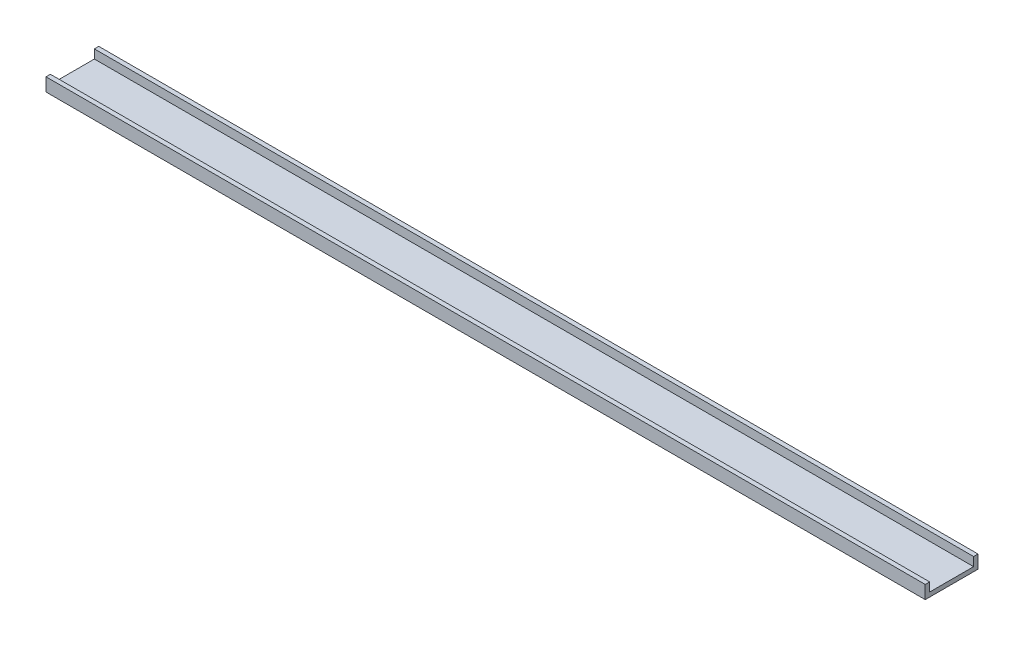
ISO-10303-21;
HEADER;
FILE_DESCRIPTION(('STEP AP214'),'2;1');
FILE_NAME('part.step','',(''),(''),'','','');
FILE_SCHEMA(('AUTOMOTIVE_DESIGN { 1 0 10303 214 1 1 1 1 }'));
ENDSEC;
DATA;
#1=APPLICATION_CONTEXT('core data for automotive mechanical design processes');
#2=APPLICATION_PROTOCOL_DEFINITION('international standard','automotive_design',2000,#1);
#3=PRODUCT_CONTEXT('',#1,'mechanical');
#4=PRODUCT('Part','Part','',(#3));
#5=PRODUCT_RELATED_PRODUCT_CATEGORY('part','',(#4));
#6=PRODUCT_DEFINITION_FORMATION('','',#4);
#7=PRODUCT_DEFINITION_CONTEXT('part definition',#1,'design');
#8=PRODUCT_DEFINITION('design','',#6,#7);
#9=PRODUCT_DEFINITION_SHAPE('','',#8);
#10=(LENGTH_UNIT() NAMED_UNIT(*) SI_UNIT(.MILLI.,.METRE.));
#11=(NAMED_UNIT(*) PLANE_ANGLE_UNIT() SI_UNIT($,.RADIAN.));
#12=(NAMED_UNIT(*) SI_UNIT($,.STERADIAN.) SOLID_ANGLE_UNIT());
#13=UNCERTAINTY_MEASURE_WITH_UNIT(LENGTH_MEASURE(1.E-05),#10,'distance_accuracy_value','');
#14=(GEOMETRIC_REPRESENTATION_CONTEXT(3) GLOBAL_UNCERTAINTY_ASSIGNED_CONTEXT((#13)) GLOBAL_UNIT_ASSIGNED_CONTEXT((#10,
#11,#12)) REPRESENTATION_CONTEXT('',''));
#15=CARTESIAN_POINT('',(0.,0.,0.));
#16=DIRECTION('',(0.,0.,1.));
#17=DIRECTION('',(1.,0.,0.));
#18=AXIS2_PLACEMENT_3D('',#15,#16,#17);
#19=CARTESIAN_POINT('',(0.,25.5,0.));
#20=DIRECTION('',(0.,1.,0.));
#21=DIRECTION('',(0.,0.,1.));
#22=AXIS2_PLACEMENT_3D('',#19,#20,#21);
#23=PLANE('',#22);
#24=DIRECTION('',(-1.,0.,0.));
#25=VECTOR('',#24,1.);
#26=CARTESIAN_POINT('',(-434.042553191489,25.5,-134.673758865248));
#27=LINE('',#26,#25);
#28=CARTESIAN_POINT('',(1265.95744680851,25.5,-134.673758865248));
#29=VERTEX_POINT('',#28);
#30=CARTESIAN_POINT('',(-434.042553191489,25.5,-134.673758865248));
#31=VERTEX_POINT('',#30);
#32=EDGE_CURVE('E124',#29,#31,#27,.T.);
#33=ORIENTED_EDGE('',*,*,#32,.F.);
#34=DIRECTION('',(0.,0.,-1.));
#35=VECTOR('',#34,1.);
#36=CARTESIAN_POINT('',(1265.95744680851,25.5,-143.173758865248));
#37=LINE('',#36,#35);
#38=CARTESIAN_POINT('',(1265.95744680851,25.5,-143.173758865248));
#39=VERTEX_POINT('',#38);
#40=EDGE_CURVE('E137',#29,#39,#37,.T.);
#41=ORIENTED_EDGE('',*,*,#40,.T.);
#42=DIRECTION('',(-1.,0.,0.));
#43=VECTOR('',#42,1.);
#44=CARTESIAN_POINT('',(-434.042553191489,25.5,-143.173758865248));
#45=LINE('',#44,#43);
#46=CARTESIAN_POINT('',(-434.042553191489,25.5,-143.173758865248));
#47=VERTEX_POINT('',#46);
#48=EDGE_CURVE('E58',#39,#47,#45,.T.);
#49=ORIENTED_EDGE('',*,*,#48,.T.);
#50=DIRECTION('',(0.,0.,1.));
#51=VECTOR('',#50,1.);
#52=CARTESIAN_POINT('',(-434.042553191489,25.5,-143.173758865248));
#53=LINE('',#52,#51);
#54=EDGE_CURVE('E133',#47,#31,#53,.T.);
#55=ORIENTED_EDGE('',*,*,#54,.T.);
#56=EDGE_LOOP('',(#33,#41,#49,#55));
#57=FACE_BOUND('',#56,.T.);
#58=ADVANCED_FACE('F34',(#57),#23,.T.);
#59=CARTESIAN_POINT('',(-434.042553191489,25.5,-143.173758865248));
#60=DIRECTION('',(1.,0.,0.));
#61=DIRECTION('',(0.,0.,-1.));
#62=AXIS2_PLACEMENT_3D('',#59,#60,#61);
#63=PLANE('',#62);
#64=DIRECTION('',(0.,0.,1.));
#65=VECTOR('',#64,1.);
#66=CARTESIAN_POINT('',(-434.042553191489,8.5,-134.673758865248));
#67=LINE('',#66,#65);
#68=CARTESIAN_POINT('',(-434.042553191489,8.5,-134.673758865248));
#69=VERTEX_POINT('',#68);
#70=CARTESIAN_POINT('',(-434.042553191489,8.5,-49.6737588652483));
#71=VERTEX_POINT('',#70);
#72=EDGE_CURVE('E115',#69,#71,#67,.T.);
#73=ORIENTED_EDGE('',*,*,#72,.F.);
#74=DIRECTION('',(0.,1.,0.));
#75=VECTOR('',#74,1.);
#76=CARTESIAN_POINT('',(-434.042553191489,8.5,-134.673758865248));
#77=LINE('',#76,#75);
#78=EDGE_CURVE('E147',#69,#31,#77,.T.);
#79=ORIENTED_EDGE('',*,*,#78,.T.);
#80=ORIENTED_EDGE('',*,*,#54,.F.);
#81=DIRECTION('',(0.,-1.,0.));
#82=VECTOR('',#81,1.);
#83=CARTESIAN_POINT('',(-434.042553191489,25.5,-143.173758865248));
#84=LINE('',#83,#82);
#85=CARTESIAN_POINT('',(-434.042553191489,0.,-143.173758865248));
#86=VERTEX_POINT('',#85);
#87=EDGE_CURVE('E142',#47,#86,#84,.T.);
#88=ORIENTED_EDGE('',*,*,#87,.T.);
#89=DIRECTION('',(0.,0.,1.));
#90=VECTOR('',#89,1.);
#91=CARTESIAN_POINT('',(-434.042553191489,0.,-143.173758865248));
#92=LINE('',#91,#90);
#93=CARTESIAN_POINT('',(-434.042553191489,0.,-41.1737588652483));
#94=VERTEX_POINT('',#93);
#95=EDGE_CURVE('E143',#86,#94,#92,.T.);
#96=ORIENTED_EDGE('',*,*,#95,.T.);
#97=DIRECTION('',(0.,-1.,0.));
#98=VECTOR('',#97,1.);
#99=CARTESIAN_POINT('',(-434.042553191489,25.5,-41.1737588652483));
#100=LINE('',#99,#98);
#101=CARTESIAN_POINT('',(-434.042553191489,25.5,-41.1737588652483));
#102=VERTEX_POINT('',#101);
#103=EDGE_CURVE('E11',#102,#94,#100,.T.);
#104=ORIENTED_EDGE('',*,*,#103,.F.);
#105=CARTESIAN_POINT('',(-434.042553191489,25.5,-49.6737588652483));
#106=VERTEX_POINT('',#105);
#107=EDGE_CURVE('E86',#106,#102,#53,.T.);
#108=ORIENTED_EDGE('',*,*,#107,.F.);
#109=DIRECTION('',(0.,1.,0.));
#110=VECTOR('',#109,1.);
#111=CARTESIAN_POINT('',(-434.042553191489,8.5,-49.6737588652483));
#112=LINE('',#111,#110);
#113=EDGE_CURVE('E49',#71,#106,#112,.T.);
#114=ORIENTED_EDGE('',*,*,#113,.F.);
#115=EDGE_LOOP('',(#73,#79,#80,#88,#96,#104,#108,#114));
#116=FACE_BOUND('',#115,.T.);
#117=ADVANCED_FACE('F36',(#116),#63,.F.);
#118=CARTESIAN_POINT('',(-434.042553191489,25.5,-41.1737588652483));
#119=DIRECTION('',(0.,0.,-1.));
#120=DIRECTION('',(-1.,0.,0.));
#121=AXIS2_PLACEMENT_3D('',#118,#119,#120);
#122=PLANE('',#121);
#123=DIRECTION('',(1.,0.,0.));
#124=VECTOR('',#123,1.);
#125=CARTESIAN_POINT('',(-434.042553191489,0.,-41.1737588652483));
#126=LINE('',#125,#124);
#127=CARTESIAN_POINT('',(1265.95744680851,0.,-41.1737588652483));
#128=VERTEX_POINT('',#127);
#129=EDGE_CURVE('E146',#94,#128,#126,.T.);
#130=ORIENTED_EDGE('',*,*,#129,.T.);
#131=DIRECTION('',(0.,-1.,0.));
#132=VECTOR('',#131,1.);
#133=CARTESIAN_POINT('',(1265.95744680851,25.5,-41.1737588652483));
#134=LINE('',#133,#132);
#135=CARTESIAN_POINT('',(1265.95744680851,25.5,-41.1737588652483));
#136=VERTEX_POINT('',#135);
#137=EDGE_CURVE('E42',#136,#128,#134,.T.);
#138=ORIENTED_EDGE('',*,*,#137,.F.);
#139=DIRECTION('',(1.,0.,0.));
#140=VECTOR('',#139,1.);
#141=CARTESIAN_POINT('',(-434.042553191489,25.5,-41.1737588652483));
#142=LINE('',#141,#140);
#143=EDGE_CURVE('E135',#102,#136,#142,.T.);
#144=ORIENTED_EDGE('',*,*,#143,.F.);
#145=ORIENTED_EDGE('',*,*,#103,.T.);
#146=EDGE_LOOP('',(#130,#138,#144,#145));
#147=FACE_BOUND('',#146,.T.);
#148=ADVANCED_FACE('F191',(#147),#122,.F.);
#149=CARTESIAN_POINT('',(1265.95744680851,25.5,-143.173758865248));
#150=DIRECTION('',(-1.,0.,0.));
#151=DIRECTION('',(0.,0.,1.));
#152=AXIS2_PLACEMENT_3D('',#149,#150,#151);
#153=PLANE('',#152);
#154=ORIENTED_EDGE('',*,*,#40,.F.);
#155=DIRECTION('',(0.,1.,0.));
#156=VECTOR('',#155,1.);
#157=CARTESIAN_POINT('',(1265.95744680851,8.5,-134.673758865248));
#158=LINE('',#157,#156);
#159=CARTESIAN_POINT('',(1265.95744680851,8.5,-134.673758865248));
#160=VERTEX_POINT('',#159);
#161=EDGE_CURVE('E128',#160,#29,#158,.T.);
#162=ORIENTED_EDGE('',*,*,#161,.F.);
#163=DIRECTION('',(0.,0.,-1.));
#164=VECTOR('',#163,1.);
#165=CARTESIAN_POINT('',(1265.95744680851,8.5,-134.673758865248));
#166=LINE('',#165,#164);
#167=CARTESIAN_POINT('',(1265.95744680851,8.5,-49.6737588652483));
#168=VERTEX_POINT('',#167);
#169=EDGE_CURVE('E114',#168,#160,#166,.T.);
#170=ORIENTED_EDGE('',*,*,#169,.F.);
#171=DIRECTION('',(0.,1.,0.));
#172=VECTOR('',#171,1.);
#173=CARTESIAN_POINT('',(1265.95744680851,8.5,-49.6737588652483));
#174=LINE('',#173,#172);
#175=CARTESIAN_POINT('',(1265.95744680851,25.5,-49.6737588652483));
#176=VERTEX_POINT('',#175);
#177=EDGE_CURVE('E111',#168,#176,#174,.T.);
#178=ORIENTED_EDGE('',*,*,#177,.T.);
#179=EDGE_CURVE('E138',#136,#176,#37,.T.);
#180=ORIENTED_EDGE('',*,*,#179,.F.);
#181=ORIENTED_EDGE('',*,*,#137,.T.);
#182=DIRECTION('',(0.,0.,-1.));
#183=VECTOR('',#182,1.);
#184=CARTESIAN_POINT('',(1265.95744680851,0.,-143.173758865248));
#185=LINE('',#184,#183);
#186=CARTESIAN_POINT('',(1265.95744680851,0.,-143.173758865248));
#187=VERTEX_POINT('',#186);
#188=EDGE_CURVE('E149',#128,#187,#185,.T.);
#189=ORIENTED_EDGE('',*,*,#188,.T.);
#190=DIRECTION('',(0.,-1.,0.));
#191=VECTOR('',#190,1.);
#192=CARTESIAN_POINT('',(1265.95744680851,25.5,-143.173758865248));
#193=LINE('',#192,#191);
#194=EDGE_CURVE('E153',#39,#187,#193,.T.);
#195=ORIENTED_EDGE('',*,*,#194,.F.);
#196=EDGE_LOOP('',(#154,#162,#170,#178,#180,#181,#189,#195));
#197=FACE_BOUND('',#196,.T.);
#198=ADVANCED_FACE('F160',(#197),#153,.F.);
#199=CARTESIAN_POINT('',(-434.042553191489,25.5,-143.173758865248));
#200=DIRECTION('',(0.,0.,1.));
#201=DIRECTION('',(1.,0.,0.));
#202=AXIS2_PLACEMENT_3D('',#199,#200,#201);
#203=PLANE('',#202);
#204=DIRECTION('',(-1.,0.,0.));
#205=VECTOR('',#204,1.);
#206=CARTESIAN_POINT('',(-434.042553191489,0.,-143.173758865248));
#207=LINE('',#206,#205);
#208=EDGE_CURVE('E79',#187,#86,#207,.T.);
#209=ORIENTED_EDGE('',*,*,#208,.T.);
#210=ORIENTED_EDGE('',*,*,#87,.F.);
#211=ORIENTED_EDGE('',*,*,#48,.F.);
#212=ORIENTED_EDGE('',*,*,#194,.T.);
#213=EDGE_LOOP('',(#209,#210,#211,#212));
#214=FACE_BOUND('',#213,.T.);
#215=ADVANCED_FACE('F167',(#214),#203,.F.);
#216=DIRECTION('',(1.,0.,0.));
#217=VECTOR('',#216,1.);
#218=CARTESIAN_POINT('',(-434.042553191489,25.5,-49.6737588652483));
#219=LINE('',#218,#217);
#220=EDGE_CURVE('E171',#106,#176,#219,.T.);
#221=ORIENTED_EDGE('',*,*,#220,.F.);
#222=ORIENTED_EDGE('',*,*,#107,.T.);
#223=ORIENTED_EDGE('',*,*,#143,.T.);
#224=ORIENTED_EDGE('',*,*,#179,.T.);
#225=EDGE_LOOP('',(#221,#222,#223,#224));
#226=FACE_BOUND('',#225,.T.);
#227=ADVANCED_FACE('F183',(#226),#23,.T.);
#228=CARTESIAN_POINT('',(0.,0.,0.));
#229=DIRECTION('',(0.,1.,0.));
#230=DIRECTION('',(0.,0.,1.));
#231=AXIS2_PLACEMENT_3D('',#228,#229,#230);
#232=PLANE('',#231);
#233=ORIENTED_EDGE('',*,*,#95,.F.);
#234=ORIENTED_EDGE('',*,*,#208,.F.);
#235=ORIENTED_EDGE('',*,*,#188,.F.);
#236=ORIENTED_EDGE('',*,*,#129,.F.);
#237=EDGE_LOOP('',(#233,#234,#235,#236));
#238=FACE_BOUND('',#237,.T.);
#239=ADVANCED_FACE('F165',(#238),#232,.F.);
#240=CARTESIAN_POINT('',(-434.042553191489,8.5,-134.673758865248));
#241=DIRECTION('',(0.,0.,-1.));
#242=DIRECTION('',(-1.,0.,0.));
#243=AXIS2_PLACEMENT_3D('',#240,#241,#242);
#244=PLANE('',#243);
#245=ORIENTED_EDGE('',*,*,#32,.T.);
#246=ORIENTED_EDGE('',*,*,#78,.F.);
#247=DIRECTION('',(-1.,0.,0.));
#248=VECTOR('',#247,1.);
#249=CARTESIAN_POINT('',(-434.042553191489,8.5,-134.673758865248));
#250=LINE('',#249,#248);
#251=EDGE_CURVE('E121',#160,#69,#250,.T.);
#252=ORIENTED_EDGE('',*,*,#251,.F.);
#253=ORIENTED_EDGE('',*,*,#161,.T.);
#254=EDGE_LOOP('',(#245,#246,#252,#253));
#255=FACE_BOUND('',#254,.T.);
#256=ADVANCED_FACE('F175',(#255),#244,.F.);
#257=CARTESIAN_POINT('',(-434.042553191489,8.5,-49.6737588652483));
#258=DIRECTION('',(0.,0.,1.));
#259=DIRECTION('',(1.,0.,0.));
#260=AXIS2_PLACEMENT_3D('',#257,#258,#259);
#261=PLANE('',#260);
#262=ORIENTED_EDGE('',*,*,#220,.T.);
#263=ORIENTED_EDGE('',*,*,#177,.F.);
#264=DIRECTION('',(1.,0.,0.));
#265=VECTOR('',#264,1.);
#266=CARTESIAN_POINT('',(-434.042553191489,8.5,-49.6737588652483));
#267=LINE('',#266,#265);
#268=EDGE_CURVE('E107',#71,#168,#267,.T.);
#269=ORIENTED_EDGE('',*,*,#268,.F.);
#270=ORIENTED_EDGE('',*,*,#113,.T.);
#271=EDGE_LOOP('',(#262,#263,#269,#270));
#272=FACE_BOUND('',#271,.T.);
#273=ADVANCED_FACE('F109',(#272),#261,.F.);
#274=CARTESIAN_POINT('',(0.,8.5,0.));
#275=DIRECTION('',(0.,1.,0.));
#276=DIRECTION('',(0.,0.,1.));
#277=AXIS2_PLACEMENT_3D('',#274,#275,#276);
#278=PLANE('',#277);
#279=ORIENTED_EDGE('',*,*,#72,.T.);
#280=ORIENTED_EDGE('',*,*,#268,.T.);
#281=ORIENTED_EDGE('',*,*,#169,.T.);
#282=ORIENTED_EDGE('',*,*,#251,.T.);
#283=EDGE_LOOP('',(#279,#280,#281,#282));
#284=FACE_BOUND('',#283,.T.);
#285=ADVANCED_FACE('F119',(#284),#278,.T.);
#286=CLOSED_SHELL('',(#58,#117,#148,#198,#215,#227,#239,#256,#273,#285));
#287=MANIFOLD_SOLID_BREP('B2',#286);
#288=ADVANCED_BREP_SHAPE_REPRESENTATION('',(#18,#287),#14);
#289=SHAPE_DEFINITION_REPRESENTATION(#9,#288);
ENDSEC;
END-ISO-10303-21;
